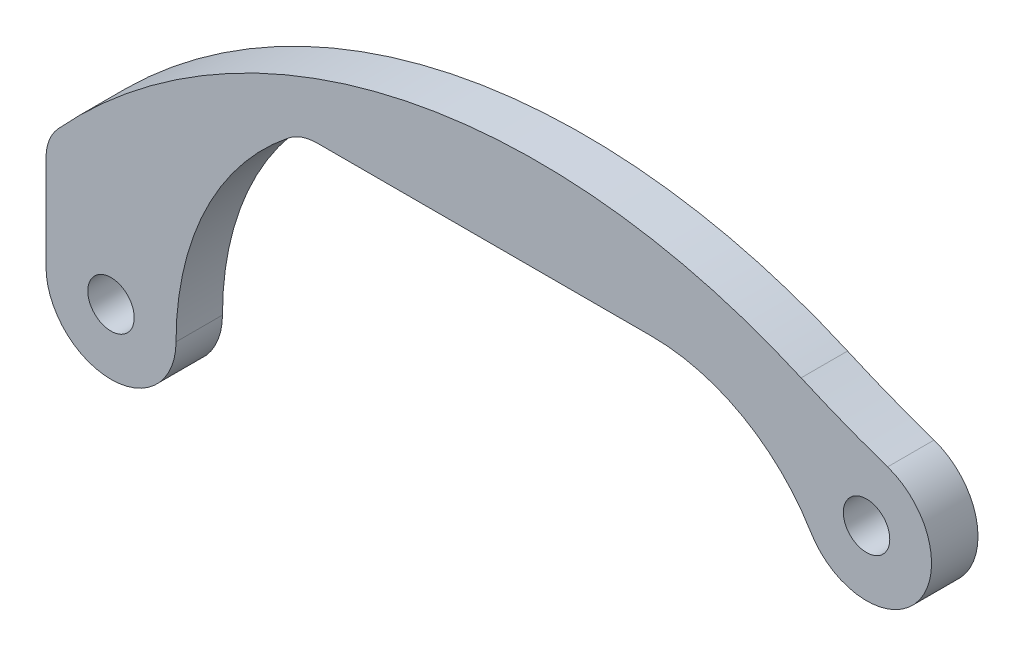
ISO-10303-21;
HEADER;
FILE_DESCRIPTION(('STEP AP214'),'2;1');
FILE_NAME('part.step','',(''),(''),'','','');
FILE_SCHEMA(('AUTOMOTIVE_DESIGN { 1 0 10303 214 1 1 1 1 }'));
ENDSEC;
DATA;
#1=APPLICATION_CONTEXT('core data for automotive mechanical design processes');
#2=APPLICATION_PROTOCOL_DEFINITION('international standard','automotive_design',2000,#1);
#3=PRODUCT_CONTEXT('',#1,'mechanical');
#4=PRODUCT('Part','Part','',(#3));
#5=PRODUCT_RELATED_PRODUCT_CATEGORY('part','',(#4));
#6=PRODUCT_DEFINITION_FORMATION('','',#4);
#7=PRODUCT_DEFINITION_CONTEXT('part definition',#1,'design');
#8=PRODUCT_DEFINITION('design','',#6,#7);
#9=PRODUCT_DEFINITION_SHAPE('','',#8);
#10=(LENGTH_UNIT() NAMED_UNIT(*) SI_UNIT(.MILLI.,.METRE.));
#11=(NAMED_UNIT(*) PLANE_ANGLE_UNIT() SI_UNIT($,.RADIAN.));
#12=(NAMED_UNIT(*) SI_UNIT($,.STERADIAN.) SOLID_ANGLE_UNIT());
#13=UNCERTAINTY_MEASURE_WITH_UNIT(LENGTH_MEASURE(1.E-05),#10,'distance_accuracy_value','');
#14=(GEOMETRIC_REPRESENTATION_CONTEXT(3) GLOBAL_UNCERTAINTY_ASSIGNED_CONTEXT((#13)) GLOBAL_UNIT_ASSIGNED_CONTEXT((#10,
#11,#12)) REPRESENTATION_CONTEXT('',''));
#15=CARTESIAN_POINT('',(0.,0.,0.));
#16=DIRECTION('',(0.,0.,1.));
#17=DIRECTION('',(1.,0.,0.));
#18=AXIS2_PLACEMENT_3D('',#15,#16,#17);
#19=CARTESIAN_POINT('',(-30.6719542333047,-74.7945228686604,3.175));
#20=DIRECTION('',(0.,0.,1.));
#21=DIRECTION('',(1.,0.,0.));
#22=AXIS2_PLACEMENT_3D('',#19,#20,#21);
#23=PLANE('',#22);
#24=CARTESIAN_POINT('',(-58.8642459320123,-101.636771367044,3.175));
#25=DIRECTION('',(0.,0.,1.));
#26=DIRECTION('',(1.,0.,0.));
#27=AXIS2_PLACEMENT_3D('',#24,#25,#26);
#28=CIRCLE('',#27,3.17500000000004);
#29=CARTESIAN_POINT('',(-55.6892459320123,-101.636771367044,3.175));
#30=VERTEX_POINT('',#29);
#31=EDGE_CURVE('E155',#30,#30,#28,.T.);
#32=ORIENTED_EDGE('',*,*,#31,.F.);
#33=EDGE_LOOP('',(#32));
#34=FACE_BOUND('',#33,.T.);
#35=CARTESIAN_POINT('',(-30.6719542333047,-74.7945228686604,3.175));
#36=DIRECTION('',(0.,0.,-1.));
#37=DIRECTION('',(1.,0.,0.));
#38=AXIS2_PLACEMENT_3D('',#35,#36,#37);
#39=CIRCLE('',#38,6.35);
#40=CARTESIAN_POINT('',(-34.623381696507,-69.8237361097004,3.175));
#41=VERTEX_POINT('',#40);
#42=CARTESIAN_POINT('',(-30.6719542333047,-68.4445228686604,3.175));
#43=VERTEX_POINT('',#42);
#44=EDGE_CURVE('E170',#41,#43,#39,.T.);
#45=ORIENTED_EDGE('',*,*,#44,.T.);
#46=DIRECTION('',(1.,0.,0.));
#47=VECTOR('',#46,1.);
#48=CARTESIAN_POINT('',(-30.6719542333047,-68.4445228686604,3.175));
#49=LINE('',#48,#47);
#50=CARTESIAN_POINT('',(15.0480457666953,-68.4445228686604,3.175));
#51=VERTEX_POINT('',#50);
#52=EDGE_CURVE('E108',#43,#51,#49,.T.);
#53=ORIENTED_EDGE('',*,*,#52,.T.);
#54=CARTESIAN_POINT('',(15.0480457666953,-93.8445228686603,3.175));
#55=DIRECTION('',(0.,0.,-1.));
#56=DIRECTION('',(-1.,0.,0.));
#57=AXIS2_PLACEMENT_3D('',#54,#55,#56);
#58=CIRCLE('',#57,25.4);
#59=CARTESIAN_POINT('',(36.8272711246987,-80.7745059289123,3.175));
#60=VERTEX_POINT('',#59);
#61=EDGE_CURVE('E191',#51,#60,#58,.T.);
#62=ORIENTED_EDGE('',*,*,#61,.T.);
#63=CARTESIAN_POINT('',(44.45,-76.2,3.175));
#64=DIRECTION('',(0.,0.,1.));
#65=DIRECTION('',(1.,0.,0.));
#66=AXIS2_PLACEMENT_3D('',#63,#64,#65);
#67=CIRCLE('',#66,8.88999999999976);
#68=CARTESIAN_POINT('',(47.3285287994346,-67.7889256363517,3.175));
#69=VERTEX_POINT('',#68);
#70=EDGE_CURVE('E210',#60,#69,#67,.T.);
#71=ORIENTED_EDGE('',*,*,#70,.T.);
#72=CARTESIAN_POINT('',(94.5625172295674,70.2290053482919,3.175));
#73=DIRECTION('',(0.,0.,-1.));
#74=DIRECTION('',(1.,0.,0.));
#75=AXIS2_PLACEMENT_3D('',#72,#73,#74);
#76=CIRCLE('',#75,145.876656584595);
#77=CARTESIAN_POINT('',(35.5031008564759,-63.1575917069211,3.175));
#78=VERTEX_POINT('',#77);
#79=EDGE_CURVE('E207',#69,#78,#76,.T.);
#80=ORIENTED_EDGE('',*,*,#79,.T.);
#81=CARTESIAN_POINT('',(-0.488827108524159,-144.445912647646,3.175));
#82=DIRECTION('',(0.,0.,1.));
#83=DIRECTION('',(1.,0.,0.));
#84=AXIS2_PLACEMENT_3D('',#81,#82,#83);
#85=CIRCLE('',#84,88.9);
#86=CARTESIAN_POINT('',(-66.0900473799741,-84.4484968791585,3.175));
#87=VERTEX_POINT('',#86);
#88=EDGE_CURVE('E209',#78,#87,#85,.T.);
#89=ORIENTED_EDGE('',*,*,#88,.T.);
#90=CARTESIAN_POINT('',(-61.4042459320134,-88.7340265769076,3.175));
#91=DIRECTION('',(0.,0.,1.));
#92=DIRECTION('',(1.,0.,0.));
#93=AXIS2_PLACEMENT_3D('',#90,#91,#92);
#94=CIRCLE('',#93,6.35000000000001);
#95=CARTESIAN_POINT('',(-67.7542459320134,-88.7340265769076,3.175));
#96=VERTEX_POINT('',#95);
#97=EDGE_CURVE('E133',#87,#96,#94,.T.);
#98=ORIENTED_EDGE('',*,*,#97,.T.);
#99=DIRECTION('',(0.,-1.,0.));
#100=VECTOR('',#99,1.);
#101=CARTESIAN_POINT('',(-67.7542459320134,-101.636771367044,3.175));
#102=LINE('',#101,#100);
#103=CARTESIAN_POINT('',(-67.7542459320134,-101.636771367044,3.175));
#104=VERTEX_POINT('',#103);
#105=EDGE_CURVE('E127',#96,#104,#102,.T.);
#106=ORIENTED_EDGE('',*,*,#105,.T.);
#107=CARTESIAN_POINT('',(-58.8642459320123,-101.636771367044,3.175));
#108=DIRECTION('',(0.,0.,1.));
#109=DIRECTION('',(1.,0.,0.));
#110=AXIS2_PLACEMENT_3D('',#107,#108,#109);
#111=CIRCLE('',#110,8.89000000000045);
#112=CARTESIAN_POINT('',(-49.9742459320119,-101.636771367044,3.175));
#113=VERTEX_POINT('',#112);
#114=EDGE_CURVE('E131',#104,#113,#111,.T.);
#115=ORIENTED_EDGE('',*,*,#114,.T.);
#116=CARTESIAN_POINT('',(-9.33424593201238,-101.636771367044,3.175));
#117=DIRECTION('',(0.,0.,-1.));
#118=DIRECTION('',(1.,0.,0.));
#119=AXIS2_PLACEMENT_3D('',#116,#117,#118);
#120=CIRCLE('',#119,40.6400000000001);
#121=EDGE_CURVE('E59',#113,#41,#120,.T.);
#122=ORIENTED_EDGE('',*,*,#121,.T.);
#123=EDGE_LOOP('',(#45,#53,#62,#71,#80,#89,#98,#106,#115,#122));
#124=FACE_BOUND('',#123,.T.);
#125=CARTESIAN_POINT('',(44.45,-76.2,3.175));
#126=DIRECTION('',(0.,0.,1.));
#127=DIRECTION('',(1.,0.,0.));
#128=AXIS2_PLACEMENT_3D('',#125,#126,#127);
#129=CIRCLE('',#128,3.175);
#130=CARTESIAN_POINT('',(47.625,-76.2,3.175));
#131=VERTEX_POINT('',#130);
#132=EDGE_CURVE('E221',#131,#131,#129,.T.);
#133=ORIENTED_EDGE('',*,*,#132,.F.);
#134=EDGE_LOOP('',(#133));
#135=FACE_BOUND('',#134,.T.);
#136=ADVANCED_FACE('F42',(#34,#124,#135),#23,.T.);
#137=CARTESIAN_POINT('',(-30.6719542333047,-74.7945228686604,-3.175));
#138=DIRECTION('',(0.,0.,1.));
#139=DIRECTION('',(1.,0.,0.));
#140=AXIS2_PLACEMENT_3D('',#137,#138,#139);
#141=PLANE('',#140);
#142=CARTESIAN_POINT('',(-58.8642459320123,-101.636771367044,-3.175));
#143=DIRECTION('',(0.,0.,1.));
#144=DIRECTION('',(1.,0.,0.));
#145=AXIS2_PLACEMENT_3D('',#142,#143,#144);
#146=CIRCLE('',#145,3.17500000000004);
#147=CARTESIAN_POINT('',(-55.6892459320123,-101.636771367044,-3.175));
#148=VERTEX_POINT('',#147);
#149=EDGE_CURVE('E218',#148,#148,#146,.T.);
#150=ORIENTED_EDGE('',*,*,#149,.T.);
#151=EDGE_LOOP('',(#150));
#152=FACE_BOUND('',#151,.T.);
#153=CARTESIAN_POINT('',(-30.6719542333047,-74.7945228686604,-3.175));
#154=DIRECTION('',(0.,0.,-1.));
#155=DIRECTION('',(1.,0.,0.));
#156=AXIS2_PLACEMENT_3D('',#153,#154,#155);
#157=CIRCLE('',#156,6.35);
#158=CARTESIAN_POINT('',(-34.623381696507,-69.8237361097004,-3.175));
#159=VERTEX_POINT('',#158);
#160=CARTESIAN_POINT('',(-30.6719542333047,-68.4445228686604,-3.175));
#161=VERTEX_POINT('',#160);
#162=EDGE_CURVE('E151',#159,#161,#157,.T.);
#163=ORIENTED_EDGE('',*,*,#162,.F.);
#164=CARTESIAN_POINT('',(-9.33424593201238,-101.636771367044,-3.175));
#165=DIRECTION('',(0.,0.,-1.));
#166=DIRECTION('',(1.,0.,0.));
#167=AXIS2_PLACEMENT_3D('',#164,#165,#166);
#168=CIRCLE('',#167,40.6400000000001);
#169=CARTESIAN_POINT('',(-49.9742459320119,-101.636771367044,-3.175));
#170=VERTEX_POINT('',#169);
#171=EDGE_CURVE('E100',#170,#159,#168,.T.);
#172=ORIENTED_EDGE('',*,*,#171,.F.);
#173=CARTESIAN_POINT('',(-58.8642459320123,-101.636771367044,-3.175));
#174=DIRECTION('',(0.,0.,1.));
#175=DIRECTION('',(1.,0.,0.));
#176=AXIS2_PLACEMENT_3D('',#173,#174,#175);
#177=CIRCLE('',#176,8.89000000000045);
#178=CARTESIAN_POINT('',(-67.7542459320134,-101.636771367044,-3.175));
#179=VERTEX_POINT('',#178);
#180=EDGE_CURVE('E94',#179,#170,#177,.T.);
#181=ORIENTED_EDGE('',*,*,#180,.F.);
#182=DIRECTION('',(0.,-1.,0.));
#183=VECTOR('',#182,1.);
#184=CARTESIAN_POINT('',(-67.7542459320134,-101.636771367044,-3.175));
#185=LINE('',#184,#183);
#186=CARTESIAN_POINT('',(-67.7542459320134,-88.7340265769076,-3.175));
#187=VERTEX_POINT('',#186);
#188=EDGE_CURVE('E141',#187,#179,#185,.T.);
#189=ORIENTED_EDGE('',*,*,#188,.F.);
#190=CARTESIAN_POINT('',(-61.4042459320134,-88.7340265769076,-3.175));
#191=DIRECTION('',(0.,0.,1.));
#192=DIRECTION('',(1.,0.,0.));
#193=AXIS2_PLACEMENT_3D('',#190,#191,#192);
#194=CIRCLE('',#193,6.35000000000001);
#195=CARTESIAN_POINT('',(-66.0900473799741,-84.4484968791585,-3.175));
#196=VERTEX_POINT('',#195);
#197=EDGE_CURVE('E165',#196,#187,#194,.T.);
#198=ORIENTED_EDGE('',*,*,#197,.F.);
#199=CARTESIAN_POINT('',(-0.488827108524159,-144.445912647646,-3.175));
#200=DIRECTION('',(0.,0.,1.));
#201=DIRECTION('',(1.,0.,0.));
#202=AXIS2_PLACEMENT_3D('',#199,#200,#201);
#203=CIRCLE('',#202,88.9);
#204=CARTESIAN_POINT('',(35.5031008564759,-63.1575917069211,-3.175));
#205=VERTEX_POINT('',#204);
#206=EDGE_CURVE('E163',#205,#196,#203,.T.);
#207=ORIENTED_EDGE('',*,*,#206,.F.);
#208=CARTESIAN_POINT('',(94.5625172295674,70.2290053482919,-3.175));
#209=DIRECTION('',(0.,0.,-1.));
#210=DIRECTION('',(1.,0.,0.));
#211=AXIS2_PLACEMENT_3D('',#208,#209,#210);
#212=CIRCLE('',#211,145.876656584595);
#213=CARTESIAN_POINT('',(47.3285287994346,-67.7889256363517,-3.175));
#214=VERTEX_POINT('',#213);
#215=EDGE_CURVE('E161',#214,#205,#212,.T.);
#216=ORIENTED_EDGE('',*,*,#215,.F.);
#217=CARTESIAN_POINT('',(44.45,-76.2,-3.175));
#218=DIRECTION('',(0.,0.,1.));
#219=DIRECTION('',(1.,0.,0.));
#220=AXIS2_PLACEMENT_3D('',#217,#218,#219);
#221=CIRCLE('',#220,8.88999999999976);
#222=CARTESIAN_POINT('',(36.8272711246987,-80.7745059289123,-3.175));
#223=VERTEX_POINT('',#222);
#224=EDGE_CURVE('E159',#223,#214,#221,.T.);
#225=ORIENTED_EDGE('',*,*,#224,.F.);
#226=CARTESIAN_POINT('',(15.0480457666953,-93.8445228686603,-3.175));
#227=DIRECTION('',(0.,0.,-1.));
#228=DIRECTION('',(-1.,0.,0.));
#229=AXIS2_PLACEMENT_3D('',#226,#227,#228);
#230=CIRCLE('',#229,25.4);
#231=CARTESIAN_POINT('',(15.0480457666953,-68.4445228686604,-3.175));
#232=VERTEX_POINT('',#231);
#233=EDGE_CURVE('E157',#232,#223,#230,.T.);
#234=ORIENTED_EDGE('',*,*,#233,.F.);
#235=DIRECTION('',(1.,0.,0.));
#236=VECTOR('',#235,1.);
#237=CARTESIAN_POINT('',(-30.6719542333047,-68.4445228686604,-3.175));
#238=LINE('',#237,#236);
#239=EDGE_CURVE('E154',#161,#232,#238,.T.);
#240=ORIENTED_EDGE('',*,*,#239,.F.);
#241=EDGE_LOOP('',(#163,#172,#181,#189,#198,#207,#216,#225,#234,#240));
#242=FACE_BOUND('',#241,.T.);
#243=CARTESIAN_POINT('',(44.45,-76.2,-3.175));
#244=DIRECTION('',(0.,0.,1.));
#245=DIRECTION('',(1.,0.,0.));
#246=AXIS2_PLACEMENT_3D('',#243,#244,#245);
#247=CIRCLE('',#246,3.175);
#248=CARTESIAN_POINT('',(47.625,-76.2,-3.175));
#249=VERTEX_POINT('',#248);
#250=EDGE_CURVE('E224',#249,#249,#247,.T.);
#251=ORIENTED_EDGE('',*,*,#250,.T.);
#252=EDGE_LOOP('',(#251));
#253=FACE_BOUND('',#252,.T.);
#254=ADVANCED_FACE('F195',(#152,#242,#253),#141,.F.);
#255=CARTESIAN_POINT('',(-30.6719542333047,-74.7945228686604,3.175));
#256=DIRECTION('',(0.,0.,-1.));
#257=DIRECTION('',(-1.,0.,0.));
#258=AXIS2_PLACEMENT_3D('',#255,#256,#257);
#259=CYLINDRICAL_SURFACE('',#258,6.35);
#260=ORIENTED_EDGE('',*,*,#162,.T.);
#261=DIRECTION('',(0.,0.,-1.));
#262=VECTOR('',#261,1.);
#263=CARTESIAN_POINT('',(-30.6719542333047,-68.4445228686604,3.175));
#264=LINE('',#263,#262);
#265=EDGE_CURVE('E13',#43,#161,#264,.T.);
#266=ORIENTED_EDGE('',*,*,#265,.F.);
#267=ORIENTED_EDGE('',*,*,#44,.F.);
#268=DIRECTION('',(0.,0.,-1.));
#269=VECTOR('',#268,1.);
#270=CARTESIAN_POINT('',(-34.623381696507,-69.8237361097004,3.175));
#271=LINE('',#270,#269);
#272=EDGE_CURVE('E147',#41,#159,#271,.T.);
#273=ORIENTED_EDGE('',*,*,#272,.T.);
#274=EDGE_LOOP('',(#260,#266,#267,#273));
#275=FACE_BOUND('',#274,.T.);
#276=ADVANCED_FACE('F44',(#275),#259,.F.);
#277=CARTESIAN_POINT('',(-30.6719542333047,-68.4445228686604,3.175));
#278=DIRECTION('',(0.,1.,0.));
#279=DIRECTION('',(0.,0.,1.));
#280=AXIS2_PLACEMENT_3D('',#277,#278,#279);
#281=PLANE('',#280);
#282=ORIENTED_EDGE('',*,*,#239,.T.);
#283=DIRECTION('',(0.,0.,-1.));
#284=VECTOR('',#283,1.);
#285=CARTESIAN_POINT('',(15.0480457666953,-68.4445228686604,3.175));
#286=LINE('',#285,#284);
#287=EDGE_CURVE('E51',#51,#232,#286,.T.);
#288=ORIENTED_EDGE('',*,*,#287,.F.);
#289=ORIENTED_EDGE('',*,*,#52,.F.);
#290=ORIENTED_EDGE('',*,*,#265,.T.);
#291=EDGE_LOOP('',(#282,#288,#289,#290));
#292=FACE_BOUND('',#291,.T.);
#293=ADVANCED_FACE('F265',(#292),#281,.F.);
#294=CARTESIAN_POINT('',(15.0480457666953,-93.8445228686603,3.175));
#295=DIRECTION('',(0.,0.,-1.));
#296=DIRECTION('',(-1.,0.,0.));
#297=AXIS2_PLACEMENT_3D('',#294,#295,#296);
#298=CYLINDRICAL_SURFACE('',#297,25.4);
#299=ORIENTED_EDGE('',*,*,#233,.T.);
#300=DIRECTION('',(0.,0.,-1.));
#301=VECTOR('',#300,1.);
#302=CARTESIAN_POINT('',(36.8272711246987,-80.7745059289123,3.175));
#303=LINE('',#302,#301);
#304=EDGE_CURVE('E183',#60,#223,#303,.T.);
#305=ORIENTED_EDGE('',*,*,#304,.F.);
#306=ORIENTED_EDGE('',*,*,#61,.F.);
#307=ORIENTED_EDGE('',*,*,#287,.T.);
#308=EDGE_LOOP('',(#299,#305,#306,#307));
#309=FACE_BOUND('',#308,.T.);
#310=ADVANCED_FACE('F189',(#309),#298,.F.);
#311=CARTESIAN_POINT('',(44.45,-76.2,3.175));
#312=DIRECTION('',(0.,0.,-1.));
#313=DIRECTION('',(-1.,0.,0.));
#314=AXIS2_PLACEMENT_3D('',#311,#312,#313);
#315=CYLINDRICAL_SURFACE('',#314,8.88999999999976);
#316=ORIENTED_EDGE('',*,*,#224,.T.);
#317=DIRECTION('',(0.,0.,-1.));
#318=VECTOR('',#317,1.);
#319=CARTESIAN_POINT('',(47.3285287994346,-67.7889256363517,3.175));
#320=LINE('',#319,#318);
#321=EDGE_CURVE('E180',#69,#214,#320,.T.);
#322=ORIENTED_EDGE('',*,*,#321,.F.);
#323=ORIENTED_EDGE('',*,*,#70,.F.);
#324=ORIENTED_EDGE('',*,*,#304,.T.);
#325=EDGE_LOOP('',(#316,#322,#323,#324));
#326=FACE_BOUND('',#325,.T.);
#327=ADVANCED_FACE('F201',(#326),#315,.T.);
#328=CARTESIAN_POINT('',(94.5625172295674,70.2290053482919,3.175));
#329=DIRECTION('',(0.,0.,-1.));
#330=DIRECTION('',(-1.,0.,0.));
#331=AXIS2_PLACEMENT_3D('',#328,#329,#330);
#332=CYLINDRICAL_SURFACE('',#331,145.876656584595);
#333=ORIENTED_EDGE('',*,*,#215,.T.);
#334=DIRECTION('',(0.,0.,-1.));
#335=VECTOR('',#334,1.);
#336=CARTESIAN_POINT('',(35.5031008564759,-63.1575917069211,3.175));
#337=LINE('',#336,#335);
#338=EDGE_CURVE('E177',#78,#205,#337,.T.);
#339=ORIENTED_EDGE('',*,*,#338,.F.);
#340=ORIENTED_EDGE('',*,*,#79,.F.);
#341=ORIENTED_EDGE('',*,*,#321,.T.);
#342=EDGE_LOOP('',(#333,#339,#340,#341));
#343=FACE_BOUND('',#342,.T.);
#344=ADVANCED_FACE('F205',(#343),#332,.F.);
#345=CARTESIAN_POINT('',(-0.488827108524159,-144.445912647646,3.175));
#346=DIRECTION('',(0.,0.,-1.));
#347=DIRECTION('',(-1.,0.,0.));
#348=AXIS2_PLACEMENT_3D('',#345,#346,#347);
#349=CYLINDRICAL_SURFACE('',#348,88.9);
#350=ORIENTED_EDGE('',*,*,#206,.T.);
#351=DIRECTION('',(0.,0.,-1.));
#352=VECTOR('',#351,1.);
#353=CARTESIAN_POINT('',(-66.0900473799741,-84.4484968791585,3.175));
#354=LINE('',#353,#352);
#355=EDGE_CURVE('E174',#87,#196,#354,.T.);
#356=ORIENTED_EDGE('',*,*,#355,.F.);
#357=ORIENTED_EDGE('',*,*,#88,.F.);
#358=ORIENTED_EDGE('',*,*,#338,.T.);
#359=EDGE_LOOP('',(#350,#356,#357,#358));
#360=FACE_BOUND('',#359,.T.);
#361=ADVANCED_FACE('F255',(#360),#349,.T.);
#362=CARTESIAN_POINT('',(-61.4042459320134,-88.7340265769076,3.175));
#363=DIRECTION('',(0.,0.,-1.));
#364=DIRECTION('',(-1.,0.,0.));
#365=AXIS2_PLACEMENT_3D('',#362,#363,#364);
#366=CYLINDRICAL_SURFACE('',#365,6.35000000000001);
#367=ORIENTED_EDGE('',*,*,#197,.T.);
#368=DIRECTION('',(0.,0.,-1.));
#369=VECTOR('',#368,1.);
#370=CARTESIAN_POINT('',(-67.7542459320134,-88.7340265769076,3.175));
#371=LINE('',#370,#369);
#372=EDGE_CURVE('E142',#96,#187,#371,.T.);
#373=ORIENTED_EDGE('',*,*,#372,.F.);
#374=ORIENTED_EDGE('',*,*,#97,.F.);
#375=ORIENTED_EDGE('',*,*,#355,.T.);
#376=EDGE_LOOP('',(#367,#373,#374,#375));
#377=FACE_BOUND('',#376,.T.);
#378=ADVANCED_FACE('F252',(#377),#366,.T.);
#379=CARTESIAN_POINT('',(-67.7542459320134,-101.636771367044,3.175));
#380=DIRECTION('',(1.,0.,0.));
#381=DIRECTION('',(0.,1.,0.));
#382=AXIS2_PLACEMENT_3D('',#379,#380,#381);
#383=PLANE('',#382);
#384=ORIENTED_EDGE('',*,*,#188,.T.);
#385=DIRECTION('',(0.,0.,-1.));
#386=VECTOR('',#385,1.);
#387=CARTESIAN_POINT('',(-67.7542459320134,-101.636771367044,3.175));
#388=LINE('',#387,#386);
#389=EDGE_CURVE('E138',#104,#179,#388,.T.);
#390=ORIENTED_EDGE('',*,*,#389,.F.);
#391=ORIENTED_EDGE('',*,*,#105,.F.);
#392=ORIENTED_EDGE('',*,*,#372,.T.);
#393=EDGE_LOOP('',(#384,#390,#391,#392));
#394=FACE_BOUND('',#393,.T.);
#395=ADVANCED_FACE('F139',(#394),#383,.F.);
#396=CARTESIAN_POINT('',(-58.8642459320123,-101.636771367044,3.175));
#397=DIRECTION('',(0.,0.,-1.));
#398=DIRECTION('',(-1.,0.,0.));
#399=AXIS2_PLACEMENT_3D('',#396,#397,#398);
#400=CYLINDRICAL_SURFACE('',#399,8.89000000000045);
#401=ORIENTED_EDGE('',*,*,#180,.T.);
#402=DIRECTION('',(0.,0.,-1.));
#403=VECTOR('',#402,1.);
#404=CARTESIAN_POINT('',(-49.9742459320119,-101.636771367044,3.175));
#405=LINE('',#404,#403);
#406=EDGE_CURVE('E143',#113,#170,#405,.T.);
#407=ORIENTED_EDGE('',*,*,#406,.F.);
#408=ORIENTED_EDGE('',*,*,#114,.F.);
#409=ORIENTED_EDGE('',*,*,#389,.T.);
#410=EDGE_LOOP('',(#401,#407,#408,#409));
#411=FACE_BOUND('',#410,.T.);
#412=ADVANCED_FACE('F145',(#411),#400,.T.);
#413=CARTESIAN_POINT('',(-9.33424593201238,-101.636771367044,3.175));
#414=DIRECTION('',(0.,0.,-1.));
#415=DIRECTION('',(-1.,0.,0.));
#416=AXIS2_PLACEMENT_3D('',#413,#414,#415);
#417=CYLINDRICAL_SURFACE('',#416,40.6400000000001);
#418=ORIENTED_EDGE('',*,*,#171,.T.);
#419=ORIENTED_EDGE('',*,*,#272,.F.);
#420=ORIENTED_EDGE('',*,*,#121,.F.);
#421=ORIENTED_EDGE('',*,*,#406,.T.);
#422=EDGE_LOOP('',(#418,#419,#420,#421));
#423=FACE_BOUND('',#422,.T.);
#424=ADVANCED_FACE('F245',(#423),#417,.F.);
#425=CARTESIAN_POINT('',(-58.8642459320123,-101.636771367044,3.175));
#426=DIRECTION('',(0.,0.,-1.));
#427=DIRECTION('',(-1.,0.,0.));
#428=AXIS2_PLACEMENT_3D('',#425,#426,#427);
#429=CYLINDRICAL_SURFACE('',#428,3.17500000000004);
#430=ORIENTED_EDGE('',*,*,#31,.T.);
#431=EDGE_LOOP('',(#430));
#432=FACE_BOUND('',#431,.T.);
#433=ORIENTED_EDGE('',*,*,#149,.F.);
#434=EDGE_LOOP('',(#433));
#435=FACE_BOUND('',#434,.T.);
#436=ADVANCED_FACE('F242',(#432,#435),#429,.F.);
#437=CARTESIAN_POINT('',(44.45,-76.2,3.175));
#438=DIRECTION('',(0.,0.,-1.));
#439=DIRECTION('',(-1.,0.,0.));
#440=AXIS2_PLACEMENT_3D('',#437,#438,#439);
#441=CYLINDRICAL_SURFACE('',#440,3.175);
#442=ORIENTED_EDGE('',*,*,#132,.T.);
#443=EDGE_LOOP('',(#442));
#444=FACE_BOUND('',#443,.T.);
#445=ORIENTED_EDGE('',*,*,#250,.F.);
#446=EDGE_LOOP('',(#445));
#447=FACE_BOUND('',#446,.T.);
#448=ADVANCED_FACE('F230',(#444,#447),#441,.F.);
#449=CLOSED_SHELL('',(#136,#254,#276,#293,#310,#327,#344,#361,#378,#395,#412,#424,#436,#448));
#450=MANIFOLD_SOLID_BREP('B2',#449);
#451=ADVANCED_BREP_SHAPE_REPRESENTATION('',(#18,#450),#14);
#452=SHAPE_DEFINITION_REPRESENTATION(#9,#451);
ENDSEC;
END-ISO-10303-21;
